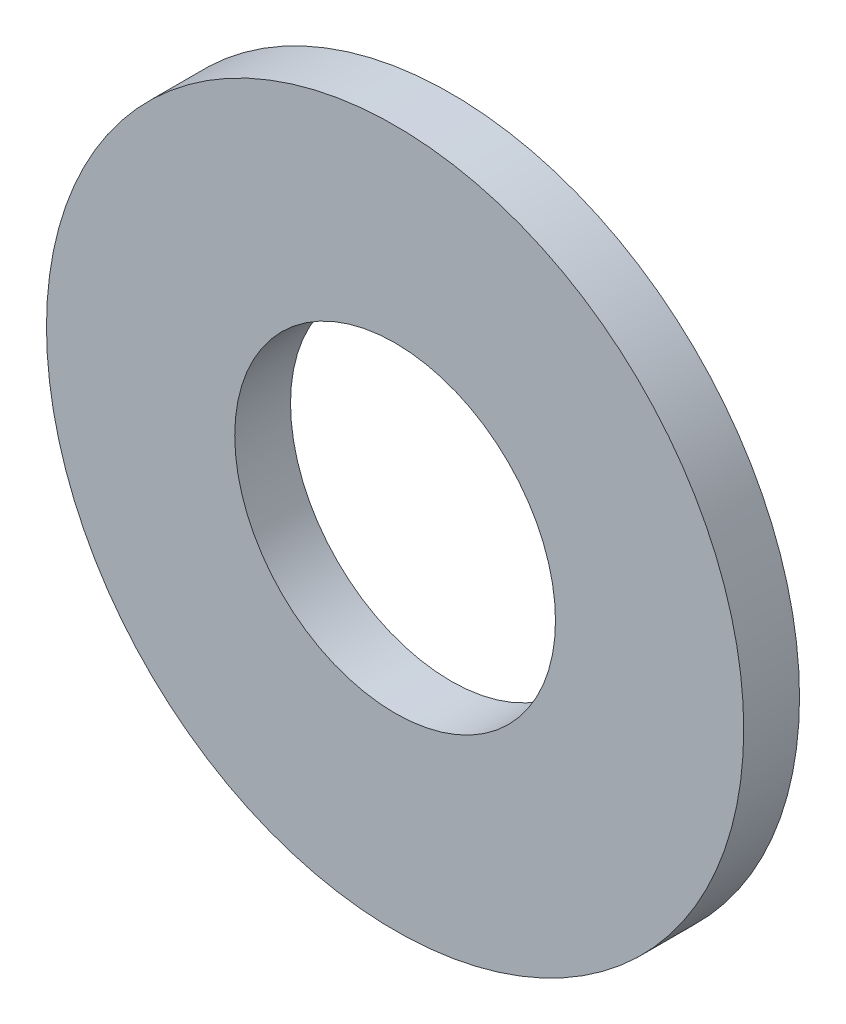
ISO-10303-21;
HEADER;
FILE_DESCRIPTION(('STEP AP214'),'2;1');
FILE_NAME('part.step','',(''),(''),'','','');
FILE_SCHEMA(('AUTOMOTIVE_DESIGN { 1 0 10303 214 1 1 1 1 }'));
ENDSEC;
DATA;
#1=APPLICATION_CONTEXT('core data for automotive mechanical design processes');
#2=APPLICATION_PROTOCOL_DEFINITION('international standard','automotive_design',2000,#1);
#3=PRODUCT_CONTEXT('',#1,'mechanical');
#4=PRODUCT('Part','Part','',(#3));
#5=PRODUCT_RELATED_PRODUCT_CATEGORY('part','',(#4));
#6=PRODUCT_DEFINITION_FORMATION('','',#4);
#7=PRODUCT_DEFINITION_CONTEXT('part definition',#1,'design');
#8=PRODUCT_DEFINITION('design','',#6,#7);
#9=PRODUCT_DEFINITION_SHAPE('','',#8);
#10=(LENGTH_UNIT() NAMED_UNIT(*) SI_UNIT(.MILLI.,.METRE.));
#11=(NAMED_UNIT(*) PLANE_ANGLE_UNIT() SI_UNIT($,.RADIAN.));
#12=(NAMED_UNIT(*) SI_UNIT($,.STERADIAN.) SOLID_ANGLE_UNIT());
#13=UNCERTAINTY_MEASURE_WITH_UNIT(LENGTH_MEASURE(1.E-05),#10,'distance_accuracy_value','');
#14=(GEOMETRIC_REPRESENTATION_CONTEXT(3) GLOBAL_UNCERTAINTY_ASSIGNED_CONTEXT((#13)) GLOBAL_UNIT_ASSIGNED_CONTEXT((#10,
#11,#12)) REPRESENTATION_CONTEXT('',''));
#15=CARTESIAN_POINT('',(0.,0.,0.));
#16=DIRECTION('',(0.,0.,1.));
#17=DIRECTION('',(1.,0.,0.));
#18=AXIS2_PLACEMENT_3D('',#15,#16,#17);
#19=CARTESIAN_POINT('',(0.,0.,-1.016));
#20=DIRECTION('',(0.,0.,1.));
#21=DIRECTION('',(1.,0.,0.));
#22=AXIS2_PLACEMENT_3D('',#19,#20,#21);
#23=CYLINDRICAL_SURFACE('',#22,6.35);
#24=CARTESIAN_POINT('',(0.,0.,-1.016));
#25=DIRECTION('',(0.,0.,1.));
#26=DIRECTION('',(1.,0.,0.));
#27=AXIS2_PLACEMENT_3D('',#24,#25,#26);
#28=CIRCLE('',#27,6.35);
#29=CARTESIAN_POINT('',(6.35,0.,-1.016));
#30=VERTEX_POINT('',#29);
#31=EDGE_CURVE('E10',#30,#30,#28,.T.);
#32=ORIENTED_EDGE('',*,*,#31,.T.);
#33=EDGE_LOOP('',(#32));
#34=FACE_BOUND('',#33,.T.);
#35=CARTESIAN_POINT('',(0.,0.,0.));
#36=DIRECTION('',(0.,0.,1.));
#37=DIRECTION('',(1.,0.,0.));
#38=AXIS2_PLACEMENT_3D('',#35,#36,#37);
#39=CIRCLE('',#38,6.35);
#40=CARTESIAN_POINT('',(6.35,0.,0.));
#41=VERTEX_POINT('',#40);
#42=EDGE_CURVE('E38',#41,#41,#39,.T.);
#43=ORIENTED_EDGE('',*,*,#42,.F.);
#44=EDGE_LOOP('',(#43));
#45=FACE_BOUND('',#44,.T.);
#46=ADVANCED_FACE('F35',(#34,#45),#23,.T.);
#47=CARTESIAN_POINT('',(0.,0.,-1.016));
#48=DIRECTION('',(0.,0.,1.));
#49=DIRECTION('',(1.,0.,0.));
#50=AXIS2_PLACEMENT_3D('',#47,#48,#49);
#51=PLANE('',#50);
#52=CARTESIAN_POINT('',(0.,0.,-1.016));
#53=DIRECTION('',(0.,0.,1.));
#54=DIRECTION('',(1.,0.,0.));
#55=AXIS2_PLACEMENT_3D('',#52,#53,#54);
#56=CIRCLE('',#55,2.921);
#57=CARTESIAN_POINT('',(2.921,0.,-1.016));
#58=VERTEX_POINT('',#57);
#59=EDGE_CURVE('E45',#58,#58,#56,.T.);
#60=ORIENTED_EDGE('',*,*,#59,.T.);
#61=EDGE_LOOP('',(#60));
#62=FACE_BOUND('',#61,.T.);
#63=ORIENTED_EDGE('',*,*,#31,.F.);
#64=EDGE_LOOP('',(#63));
#65=FACE_BOUND('',#64,.T.);
#66=ADVANCED_FACE('F53',(#62,#65),#51,.F.);
#67=CARTESIAN_POINT('',(0.,0.,0.));
#68=DIRECTION('',(0.,0.,1.));
#69=DIRECTION('',(1.,0.,0.));
#70=AXIS2_PLACEMENT_3D('',#67,#68,#69);
#71=PLANE('',#70);
#72=CARTESIAN_POINT('',(0.,0.,0.));
#73=DIRECTION('',(0.,0.,1.));
#74=DIRECTION('',(1.,0.,0.));
#75=AXIS2_PLACEMENT_3D('',#72,#73,#74);
#76=CIRCLE('',#75,2.921);
#77=CARTESIAN_POINT('',(2.921,0.,0.));
#78=VERTEX_POINT('',#77);
#79=EDGE_CURVE('E47',#78,#78,#76,.T.);
#80=ORIENTED_EDGE('',*,*,#79,.F.);
#81=EDGE_LOOP('',(#80));
#82=FACE_BOUND('',#81,.T.);
#83=ORIENTED_EDGE('',*,*,#42,.T.);
#84=EDGE_LOOP('',(#83));
#85=FACE_BOUND('',#84,.T.);
#86=ADVANCED_FACE('F59',(#82,#85),#71,.T.);
#87=CARTESIAN_POINT('',(0.,0.,-1.016));
#88=DIRECTION('',(0.,0.,1.));
#89=DIRECTION('',(1.,0.,0.));
#90=AXIS2_PLACEMENT_3D('',#87,#88,#89);
#91=CYLINDRICAL_SURFACE('',#90,2.921);
#92=ORIENTED_EDGE('',*,*,#59,.F.);
#93=EDGE_LOOP('',(#92));
#94=FACE_BOUND('',#93,.T.);
#95=ORIENTED_EDGE('',*,*,#79,.T.);
#96=EDGE_LOOP('',(#95));
#97=FACE_BOUND('',#96,.T.);
#98=ADVANCED_FACE('F56',(#94,#97),#91,.F.);
#99=CLOSED_SHELL('',(#46,#66,#86,#98));
#100=MANIFOLD_SOLID_BREP('B2',#99);
#101=ADVANCED_BREP_SHAPE_REPRESENTATION('',(#18,#100),#14);
#102=SHAPE_DEFINITION_REPRESENTATION(#9,#101);
ENDSEC;
END-ISO-10303-21;
